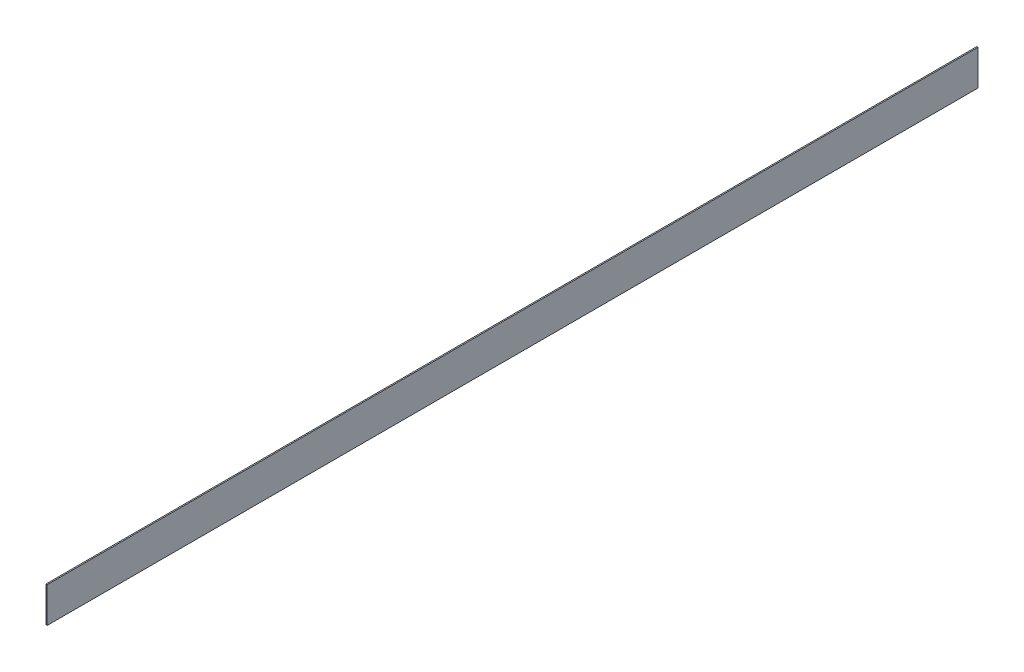
ISO-10303-21;
HEADER;
FILE_DESCRIPTION(('STEP AP214'),'2;1');
FILE_NAME('part.step','',(''),(''),'','','');
FILE_SCHEMA(('AUTOMOTIVE_DESIGN { 1 0 10303 214 1 1 1 1 }'));
ENDSEC;
DATA;
#1=APPLICATION_CONTEXT('core data for automotive mechanical design processes');
#2=APPLICATION_PROTOCOL_DEFINITION('international standard','automotive_design',2000,#1);
#3=PRODUCT_CONTEXT('',#1,'mechanical');
#4=PRODUCT('Part','Part','',(#3));
#5=PRODUCT_RELATED_PRODUCT_CATEGORY('part','',(#4));
#6=PRODUCT_DEFINITION_FORMATION('','',#4);
#7=PRODUCT_DEFINITION_CONTEXT('part definition',#1,'design');
#8=PRODUCT_DEFINITION('design','',#6,#7);
#9=PRODUCT_DEFINITION_SHAPE('','',#8);
#10=(LENGTH_UNIT() NAMED_UNIT(*) SI_UNIT(.MILLI.,.METRE.));
#11=(NAMED_UNIT(*) PLANE_ANGLE_UNIT() SI_UNIT($,.RADIAN.));
#12=(NAMED_UNIT(*) SI_UNIT($,.STERADIAN.) SOLID_ANGLE_UNIT());
#13=UNCERTAINTY_MEASURE_WITH_UNIT(LENGTH_MEASURE(1.E-05),#10,'distance_accuracy_value','');
#14=(GEOMETRIC_REPRESENTATION_CONTEXT(3) GLOBAL_UNCERTAINTY_ASSIGNED_CONTEXT((#13)) GLOBAL_UNIT_ASSIGNED_CONTEXT((#10,
#11,#12)) REPRESENTATION_CONTEXT('',''));
#15=CARTESIAN_POINT('',(0.,0.,0.));
#16=DIRECTION('',(0.,0.,1.));
#17=DIRECTION('',(1.,0.,0.));
#18=AXIS2_PLACEMENT_3D('',#15,#16,#17);
#19=CARTESIAN_POINT('',(0.25,7.49999999999999,197.5));
#20=DIRECTION('',(0.,0.,-1.));
#21=DIRECTION('',(-1.,0.,0.));
#22=AXIS2_PLACEMENT_3D('',#19,#20,#21);
#23=PLANE('',#22);
#24=DIRECTION('',(0.,-1.,0.));
#25=VECTOR('',#24,1.);
#26=CARTESIAN_POINT('',(-0.25,7.49999999999999,197.5));
#27=LINE('',#26,#25);
#28=CARTESIAN_POINT('',(-0.25,7.49999999999999,197.5));
#29=VERTEX_POINT('',#28);
#30=CARTESIAN_POINT('',(-0.25,-7.50000000000001,197.5));
#31=VERTEX_POINT('',#30);
#32=EDGE_CURVE('E98',#29,#31,#27,.T.);
#33=ORIENTED_EDGE('',*,*,#32,.T.);
#34=DIRECTION('',(-1.,0.,0.));
#35=VECTOR('',#34,1.);
#36=CARTESIAN_POINT('',(0.25,-7.50000000000001,197.5));
#37=LINE('',#36,#35);
#38=CARTESIAN_POINT('',(0.25,-7.50000000000001,197.5));
#39=VERTEX_POINT('',#38);
#40=EDGE_CURVE('E11',#39,#31,#37,.T.);
#41=ORIENTED_EDGE('',*,*,#40,.F.);
#42=DIRECTION('',(0.,-1.,0.));
#43=VECTOR('',#42,1.);
#44=CARTESIAN_POINT('',(0.25,7.49999999999999,197.5));
#45=LINE('',#44,#43);
#46=CARTESIAN_POINT('',(0.25,7.49999999999999,197.5));
#47=VERTEX_POINT('',#46);
#48=EDGE_CURVE('E86',#47,#39,#45,.T.);
#49=ORIENTED_EDGE('',*,*,#48,.F.);
#50=DIRECTION('',(-1.,0.,0.));
#51=VECTOR('',#50,1.);
#52=CARTESIAN_POINT('',(0.25,7.49999999999999,197.5));
#53=LINE('',#52,#51);
#54=EDGE_CURVE('E94',#47,#29,#53,.T.);
#55=ORIENTED_EDGE('',*,*,#54,.T.);
#56=EDGE_LOOP('',(#33,#41,#49,#55));
#57=FACE_BOUND('',#56,.T.);
#58=ADVANCED_FACE('F35',(#57),#23,.F.);
#59=CARTESIAN_POINT('',(0.25,-7.50000000000001,197.5));
#60=DIRECTION('',(0.,1.,0.));
#61=DIRECTION('',(0.,0.,1.));
#62=AXIS2_PLACEMENT_3D('',#59,#60,#61);
#63=PLANE('',#62);
#64=DIRECTION('',(0.,0.,-1.));
#65=VECTOR('',#64,1.);
#66=CARTESIAN_POINT('',(-0.25,-7.50000000000001,197.5));
#67=LINE('',#66,#65);
#68=CARTESIAN_POINT('',(-0.25,-7.50000000000001,-197.5));
#69=VERTEX_POINT('',#68);
#70=EDGE_CURVE('E90',#31,#69,#67,.T.);
#71=ORIENTED_EDGE('',*,*,#70,.T.);
#72=DIRECTION('',(-1.,0.,0.));
#73=VECTOR('',#72,1.);
#74=CARTESIAN_POINT('',(0.25,-7.50000000000001,-197.5));
#75=LINE('',#74,#73);
#76=CARTESIAN_POINT('',(0.25,-7.50000000000001,-197.5));
#77=VERTEX_POINT('',#76);
#78=EDGE_CURVE('E43',#77,#69,#75,.T.);
#79=ORIENTED_EDGE('',*,*,#78,.F.);
#80=DIRECTION('',(0.,0.,-1.));
#81=VECTOR('',#80,1.);
#82=CARTESIAN_POINT('',(0.25,-7.50000000000001,197.5));
#83=LINE('',#82,#81);
#84=EDGE_CURVE('E81',#39,#77,#83,.T.);
#85=ORIENTED_EDGE('',*,*,#84,.F.);
#86=ORIENTED_EDGE('',*,*,#40,.T.);
#87=EDGE_LOOP('',(#71,#79,#85,#86));
#88=FACE_BOUND('',#87,.T.);
#89=ADVANCED_FACE('F89',(#88),#63,.F.);
#90=CARTESIAN_POINT('',(0.25,7.49999999999999,-197.5));
#91=DIRECTION('',(0.,0.,1.));
#92=DIRECTION('',(1.,0.,0.));
#93=AXIS2_PLACEMENT_3D('',#90,#91,#92);
#94=PLANE('',#93);
#95=DIRECTION('',(0.,1.,0.));
#96=VECTOR('',#95,1.);
#97=CARTESIAN_POINT('',(-0.25,7.49999999999999,-197.5));
#98=LINE('',#97,#96);
#99=CARTESIAN_POINT('',(-0.25,7.49999999999999,-197.5));
#100=VERTEX_POINT('',#99);
#101=EDGE_CURVE('E68',#69,#100,#98,.T.);
#102=ORIENTED_EDGE('',*,*,#101,.T.);
#103=DIRECTION('',(-1.,0.,0.));
#104=VECTOR('',#103,1.);
#105=CARTESIAN_POINT('',(0.25,7.49999999999999,-197.5));
#106=LINE('',#105,#104);
#107=CARTESIAN_POINT('',(0.25,7.49999999999999,-197.5));
#108=VERTEX_POINT('',#107);
#109=EDGE_CURVE('E91',#108,#100,#106,.T.);
#110=ORIENTED_EDGE('',*,*,#109,.F.);
#111=DIRECTION('',(0.,1.,0.));
#112=VECTOR('',#111,1.);
#113=CARTESIAN_POINT('',(0.25,7.49999999999999,-197.5));
#114=LINE('',#113,#112);
#115=EDGE_CURVE('E84',#77,#108,#114,.T.);
#116=ORIENTED_EDGE('',*,*,#115,.F.);
#117=ORIENTED_EDGE('',*,*,#78,.T.);
#118=EDGE_LOOP('',(#102,#110,#116,#117));
#119=FACE_BOUND('',#118,.T.);
#120=ADVANCED_FACE('F92',(#119),#94,.F.);
#121=CARTESIAN_POINT('',(0.25,7.49999999999999,197.5));
#122=DIRECTION('',(0.,-1.,0.));
#123=DIRECTION('',(0.,0.,-1.));
#124=AXIS2_PLACEMENT_3D('',#121,#122,#123);
#125=PLANE('',#124);
#126=DIRECTION('',(0.,0.,1.));
#127=VECTOR('',#126,1.);
#128=CARTESIAN_POINT('',(-0.25,7.49999999999999,197.5));
#129=LINE('',#128,#127);
#130=EDGE_CURVE('E74',#100,#29,#129,.T.);
#131=ORIENTED_EDGE('',*,*,#130,.T.);
#132=ORIENTED_EDGE('',*,*,#54,.F.);
#133=DIRECTION('',(0.,0.,1.));
#134=VECTOR('',#133,1.);
#135=CARTESIAN_POINT('',(0.25,7.49999999999999,197.5));
#136=LINE('',#135,#134);
#137=EDGE_CURVE('E51',#108,#47,#136,.T.);
#138=ORIENTED_EDGE('',*,*,#137,.F.);
#139=ORIENTED_EDGE('',*,*,#109,.T.);
#140=EDGE_LOOP('',(#131,#132,#138,#139));
#141=FACE_BOUND('',#140,.T.);
#142=ADVANCED_FACE('F105',(#141),#125,.F.);
#143=CARTESIAN_POINT('',(0.25,0.,0.));
#144=DIRECTION('',(1.,0.,0.));
#145=DIRECTION('',(0.,0.,-1.));
#146=AXIS2_PLACEMENT_3D('',#143,#144,#145);
#147=PLANE('',#146);
#148=ORIENTED_EDGE('',*,*,#48,.T.);
#149=ORIENTED_EDGE('',*,*,#84,.T.);
#150=ORIENTED_EDGE('',*,*,#115,.T.);
#151=ORIENTED_EDGE('',*,*,#137,.T.);
#152=EDGE_LOOP('',(#148,#149,#150,#151));
#153=FACE_BOUND('',#152,.T.);
#154=ADVANCED_FACE('F82',(#153),#147,.T.);
#155=CARTESIAN_POINT('',(-0.25,0.,0.));
#156=DIRECTION('',(1.,0.,0.));
#157=DIRECTION('',(0.,0.,-1.));
#158=AXIS2_PLACEMENT_3D('',#155,#156,#157);
#159=PLANE('',#158);
#160=ORIENTED_EDGE('',*,*,#32,.F.);
#161=ORIENTED_EDGE('',*,*,#130,.F.);
#162=ORIENTED_EDGE('',*,*,#101,.F.);
#163=ORIENTED_EDGE('',*,*,#70,.F.);
#164=EDGE_LOOP('',(#160,#161,#162,#163));
#165=FACE_BOUND('',#164,.T.);
#166=ADVANCED_FACE('F108',(#165),#159,.F.);
#167=CLOSED_SHELL('',(#58,#89,#120,#142,#154,#166));
#168=MANIFOLD_SOLID_BREP('B2',#167);
#169=ADVANCED_BREP_SHAPE_REPRESENTATION('',(#18,#168),#14);
#170=SHAPE_DEFINITION_REPRESENTATION(#9,#169);
ENDSEC;
END-ISO-10303-21;
